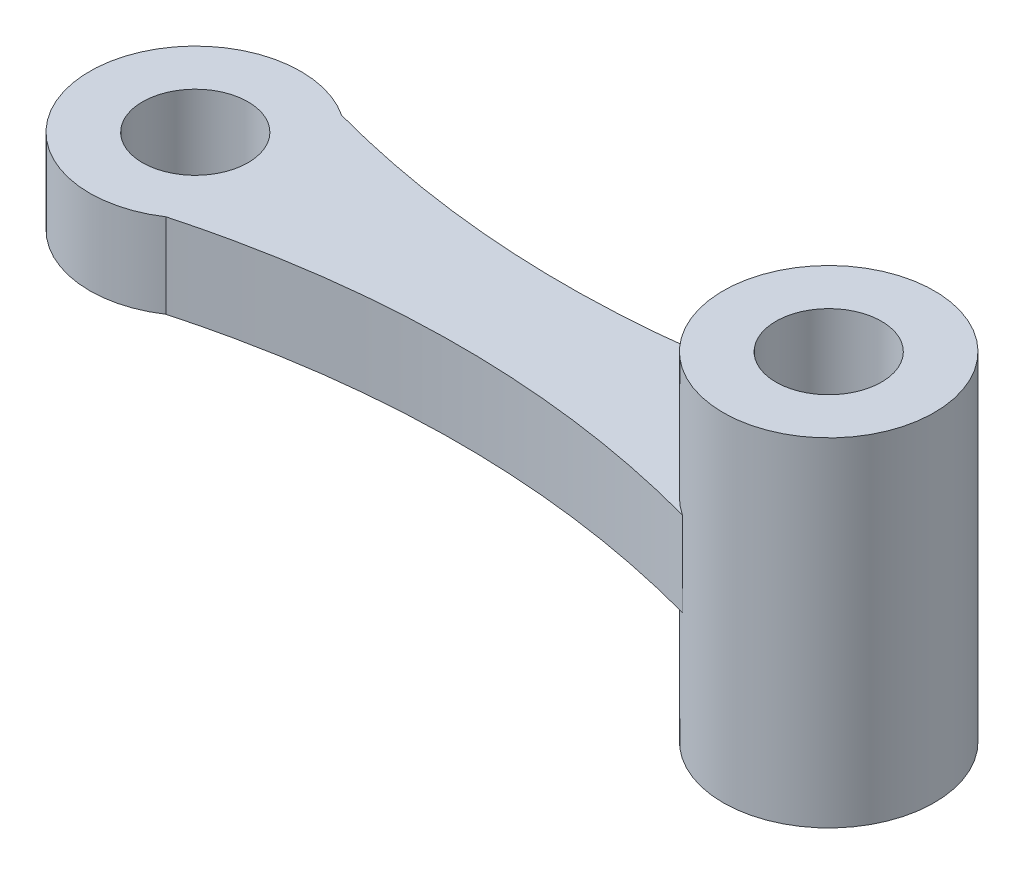
ISO-10303-21;
HEADER;
FILE_DESCRIPTION(('STEP AP214'),'2;1');
FILE_NAME('part.step','',(''),(''),'','','');
FILE_SCHEMA(('AUTOMOTIVE_DESIGN { 1 0 10303 214 1 1 1 1 }'));
ENDSEC;
DATA;
#1=APPLICATION_CONTEXT('core data for automotive mechanical design processes');
#2=APPLICATION_PROTOCOL_DEFINITION('international standard','automotive_design',2000,#1);
#3=PRODUCT_CONTEXT('',#1,'mechanical');
#4=PRODUCT('Part','Part','',(#3));
#5=PRODUCT_RELATED_PRODUCT_CATEGORY('part','',(#4));
#6=PRODUCT_DEFINITION_FORMATION('','',#4);
#7=PRODUCT_DEFINITION_CONTEXT('part definition',#1,'design');
#8=PRODUCT_DEFINITION('design','',#6,#7);
#9=PRODUCT_DEFINITION_SHAPE('','',#8);
#10=(LENGTH_UNIT() NAMED_UNIT(*) SI_UNIT(.MILLI.,.METRE.));
#11=(NAMED_UNIT(*) PLANE_ANGLE_UNIT() SI_UNIT($,.RADIAN.));
#12=(NAMED_UNIT(*) SI_UNIT($,.STERADIAN.) SOLID_ANGLE_UNIT());
#13=UNCERTAINTY_MEASURE_WITH_UNIT(LENGTH_MEASURE(1.E-05),#10,'distance_accuracy_value','');
#14=(GEOMETRIC_REPRESENTATION_CONTEXT(3) GLOBAL_UNCERTAINTY_ASSIGNED_CONTEXT((#13)) GLOBAL_UNIT_ASSIGNED_CONTEXT((#10,
#11,#12)) REPRESENTATION_CONTEXT('',''));
#15=CARTESIAN_POINT('',(0.,0.,0.));
#16=DIRECTION('',(0.,0.,1.));
#17=DIRECTION('',(1.,0.,0.));
#18=AXIS2_PLACEMENT_3D('',#15,#16,#17);
#19=CARTESIAN_POINT('',(0.,4.,0.));
#20=DIRECTION('',(0.,1.,0.));
#21=DIRECTION('',(0.,0.,1.));
#22=AXIS2_PLACEMENT_3D('',#19,#20,#21);
#23=PLANE('',#22);
#24=CARTESIAN_POINT('',(27.2283191686071,4.,4.16146432988306));
#25=CARTESIAN_POINT('',(23.1522127790642,4.,3.0538214432916));
#26=CARTESIAN_POINT('',(14.9999999999854,4.,1.94617855670989));
#27=CARTESIAN_POINT('',(6.84778722095193,4.,3.05382144328863));
#28=CARTESIAN_POINT('',(2.7716808313972,4.,4.16146432988021));
#29=B_SPLINE_CURVE_WITH_KNOTS('',3,(#24,#25,#26,#27,#28),.UNSPECIFIED.,.F.,.F.,(4,1,4),
(0.0923893610453886,0.499999999999672,0.907610638954284),.UNSPECIFIED.);
#30=CARTESIAN_POINT('',(27.2283191686071,4.,4.16146432988306));
#31=VERTEX_POINT('',#30);
#32=CARTESIAN_POINT('',(2.7716808313972,4.,4.16146432988021));
#33=VERTEX_POINT('',#32);
#34=EDGE_CURVE('E76',#31,#33,#29,.T.);
#35=ORIENTED_EDGE('',*,*,#34,.F.);
#36=CARTESIAN_POINT('',(30.,4.,0.));
#37=DIRECTION('',(0.,1.,0.));
#38=DIRECTION('',(0.,0.,1.));
#39=AXIS2_PLACEMENT_3D('',#36,#37,#38);
#40=CIRCLE('',#39,5.);
#41=CARTESIAN_POINT('',(27.2283191686028,4.,-4.16146432988021));
#42=VERTEX_POINT('',#41);
#43=EDGE_CURVE('E165',#42,#31,#40,.T.);
#44=ORIENTED_EDGE('',*,*,#43,.F.);
#45=CARTESIAN_POINT('',(2.7716808313972,4.,-4.16146432988021));
#46=CARTESIAN_POINT('',(6.84778722094081,4.,-3.05382144328833));
#47=CARTESIAN_POINT('',(14.9999999999983,4.,-1.94617855670935));
#48=CARTESIAN_POINT('',(23.1522127790509,4.,-3.05382144329299));
#49=CARTESIAN_POINT('',(27.2283191686028,4.,-4.16146432988021));
#50=B_SPLINE_CURVE_WITH_KNOTS('',3,(#45,#46,#47,#48,#49),.UNSPECIFIED.,.F.,.F.,(4,1,4),
(0.0923893610456388,0.5,0.907610638954066),.UNSPECIFIED.);
#51=CARTESIAN_POINT('',(2.7716808313972,4.,-4.16146432988021));
#52=VERTEX_POINT('',#51);
#53=EDGE_CURVE('E79',#52,#42,#50,.T.);
#54=ORIENTED_EDGE('',*,*,#53,.F.);
#55=CARTESIAN_POINT('',(0.,4.,0.));
#56=DIRECTION('',(0.,1.,0.));
#57=DIRECTION('',(0.,0.,1.));
#58=AXIS2_PLACEMENT_3D('',#55,#56,#57);
#59=CIRCLE('',#58,5.);
#60=EDGE_CURVE('E11',#52,#33,#59,.T.);
#61=ORIENTED_EDGE('',*,*,#60,.T.);
#62=EDGE_LOOP('',(#35,#44,#54,#61));
#63=FACE_BOUND('',#62,.T.);
#64=CARTESIAN_POINT('',(0.,4.,0.));
#65=DIRECTION('',(0.,1.,0.));
#66=DIRECTION('',(0.,0.,1.));
#67=AXIS2_PLACEMENT_3D('',#64,#65,#66);
#68=CIRCLE('',#67,2.5);
#69=CARTESIAN_POINT('',(0.,4.,2.5));
#70=VERTEX_POINT('',#69);
#71=EDGE_CURVE('E168',#70,#70,#68,.T.);
#72=ORIENTED_EDGE('',*,*,#71,.F.);
#73=EDGE_LOOP('',(#72));
#74=FACE_BOUND('',#73,.T.);
#75=ADVANCED_FACE('F33',(#63,#74),#23,.T.);
#76=CARTESIAN_POINT('',(0.,0.,0.));
#77=DIRECTION('',(0.,1.,0.));
#78=DIRECTION('',(0.,0.,1.));
#79=AXIS2_PLACEMENT_3D('',#76,#77,#78);
#80=PLANE('',#79);
#81=CARTESIAN_POINT('',(30.,0.,0.));
#82=DIRECTION('',(0.,1.,0.));
#83=DIRECTION('',(0.,0.,1.));
#84=AXIS2_PLACEMENT_3D('',#81,#82,#83);
#85=CIRCLE('',#84,5.);
#86=CARTESIAN_POINT('',(27.2283191686028,0.,-4.16146432988021));
#87=VERTEX_POINT('',#86);
#88=CARTESIAN_POINT('',(27.2283191686071,0.,4.16146432988306));
#89=VERTEX_POINT('',#88);
#90=EDGE_CURVE('E163',#87,#89,#85,.T.);
#91=ORIENTED_EDGE('',*,*,#90,.T.);
#92=CARTESIAN_POINT('',(27.2283191686071,0.,4.16146432988306));
#93=CARTESIAN_POINT('',(23.1522127790642,0.,3.0538214432916));
#94=CARTESIAN_POINT('',(14.9999999999854,0.,1.94617855670989));
#95=CARTESIAN_POINT('',(6.84778722095193,0.,3.05382144328863));
#96=CARTESIAN_POINT('',(2.7716808313972,0.,4.16146432988021));
#97=B_SPLINE_CURVE_WITH_KNOTS('',3,(#92,#93,#94,#95,#96),.UNSPECIFIED.,.F.,.F.,(4,1,4),
(0.0923893610453886,0.499999999999672,0.907610638954284),.UNSPECIFIED.);
#98=CARTESIAN_POINT('',(2.7716808313972,0.,4.16146432988021));
#99=VERTEX_POINT('',#98);
#100=EDGE_CURVE('E54',#89,#99,#97,.T.);
#101=ORIENTED_EDGE('',*,*,#100,.T.);
#102=CARTESIAN_POINT('',(0.,0.,0.));
#103=DIRECTION('',(0.,1.,0.));
#104=DIRECTION('',(0.,0.,1.));
#105=AXIS2_PLACEMENT_3D('',#102,#103,#104);
#106=CIRCLE('',#105,5.);
#107=CARTESIAN_POINT('',(2.7716808313972,0.,-4.16146432988021));
#108=VERTEX_POINT('',#107);
#109=EDGE_CURVE('E37',#108,#99,#106,.T.);
#110=ORIENTED_EDGE('',*,*,#109,.F.);
#111=CARTESIAN_POINT('',(2.7716808313972,0.,-4.16146432988021));
#112=CARTESIAN_POINT('',(6.84778722094081,0.,-3.05382144328833));
#113=CARTESIAN_POINT('',(14.9999999999983,0.,-1.94617855670935));
#114=CARTESIAN_POINT('',(23.1522127790509,0.,-3.05382144329299));
#115=CARTESIAN_POINT('',(27.2283191686028,0.,-4.16146432988021));
#116=B_SPLINE_CURVE_WITH_KNOTS('',3,(#111,#112,#113,#114,#115),.UNSPECIFIED.,.F.,.F.,(4,1,4),
(0.0923893610456388,0.5,0.907610638954066),.UNSPECIFIED.);
#117=EDGE_CURVE('E99',#108,#87,#116,.T.);
#118=ORIENTED_EDGE('',*,*,#117,.T.);
#119=EDGE_LOOP('',(#91,#101,#110,#118));
#120=FACE_BOUND('',#119,.T.);
#121=CARTESIAN_POINT('',(0.,0.,0.));
#122=DIRECTION('',(0.,1.,0.));
#123=DIRECTION('',(0.,0.,1.));
#124=AXIS2_PLACEMENT_3D('',#121,#122,#123);
#125=CIRCLE('',#124,2.5);
#126=CARTESIAN_POINT('',(0.,0.,2.5));
#127=VERTEX_POINT('',#126);
#128=EDGE_CURVE('E167',#127,#127,#125,.T.);
#129=ORIENTED_EDGE('',*,*,#128,.T.);
#130=EDGE_LOOP('',(#129));
#131=FACE_BOUND('',#130,.T.);
#132=ADVANCED_FACE('F135',(#120,#131),#80,.F.);
#133=CARTESIAN_POINT('',(0.,4.,0.));
#134=DIRECTION('',(0.,-1.,0.));
#135=DIRECTION('',(0.,0.,-1.));
#136=AXIS2_PLACEMENT_3D('',#133,#134,#135);
#137=CYLINDRICAL_SURFACE('',#136,5.);
#138=ORIENTED_EDGE('',*,*,#109,.T.);
#139=DIRECTION('',(0.,1.,0.));
#140=VECTOR('',#139,1.);
#141=CARTESIAN_POINT('',(2.7716808313972,-6.,4.16146432988021));
#142=LINE('',#141,#140);
#143=EDGE_CURVE('E81',#99,#33,#142,.T.);
#144=ORIENTED_EDGE('',*,*,#143,.T.);
#145=ORIENTED_EDGE('',*,*,#60,.F.);
#146=DIRECTION('',(0.,1.,0.));
#147=VECTOR('',#146,1.);
#148=CARTESIAN_POINT('',(2.7716808313972,-6.,-4.16146432988021));
#149=LINE('',#148,#147);
#150=EDGE_CURVE('E85',#108,#52,#149,.T.);
#151=ORIENTED_EDGE('',*,*,#150,.F.);
#152=EDGE_LOOP('',(#138,#144,#145,#151));
#153=FACE_BOUND('',#152,.T.);
#154=ADVANCED_FACE('F35',(#153),#137,.T.);
#155=CARTESIAN_POINT('',(30.,4.,0.));
#156=DIRECTION('',(0.,-1.,0.));
#157=DIRECTION('',(0.,0.,-1.));
#158=AXIS2_PLACEMENT_3D('',#155,#156,#157);
#159=CYLINDRICAL_SURFACE('',#158,5.);
#160=DIRECTION('',(0.,1.,0.));
#161=VECTOR('',#160,1.);
#162=CARTESIAN_POINT('',(27.2283191686071,-6.,4.16146432988306));
#163=LINE('',#162,#161);
#164=EDGE_CURVE('E82',#89,#31,#163,.T.);
#165=ORIENTED_EDGE('',*,*,#164,.F.);
#166=ORIENTED_EDGE('',*,*,#90,.F.);
#167=DIRECTION('',(0.,1.,0.));
#168=VECTOR('',#167,1.);
#169=CARTESIAN_POINT('',(27.2283191686028,-6.,-4.16146432988021));
#170=LINE('',#169,#168);
#171=EDGE_CURVE('E87',#87,#42,#170,.T.);
#172=ORIENTED_EDGE('',*,*,#171,.T.);
#173=ORIENTED_EDGE('',*,*,#43,.T.);
#174=EDGE_LOOP('',(#165,#166,#172,#173));
#175=FACE_BOUND('',#174,.T.);
#176=CARTESIAN_POINT('',(30.,-6.,0.));
#177=DIRECTION('',(0.,1.,0.));
#178=DIRECTION('',(0.,0.,1.));
#179=AXIS2_PLACEMENT_3D('',#176,#177,#178);
#180=CIRCLE('',#179,5.);
#181=CARTESIAN_POINT('',(30.,-6.,5.));
#182=VERTEX_POINT('',#181);
#183=EDGE_CURVE('E149',#182,#182,#180,.T.);
#184=ORIENTED_EDGE('',*,*,#183,.T.);
#185=EDGE_LOOP('',(#184));
#186=FACE_BOUND('',#185,.T.);
#187=CARTESIAN_POINT('',(30.,10.,0.));
#188=DIRECTION('',(0.,1.,0.));
#189=DIRECTION('',(0.,0.,1.));
#190=AXIS2_PLACEMENT_3D('',#187,#188,#189);
#191=CIRCLE('',#190,5.);
#192=CARTESIAN_POINT('',(30.,10.,5.));
#193=VERTEX_POINT('',#192);
#194=EDGE_CURVE('E152',#193,#193,#191,.T.);
#195=ORIENTED_EDGE('',*,*,#194,.F.);
#196=EDGE_LOOP('',(#195));
#197=FACE_BOUND('',#196,.T.);
#198=ADVANCED_FACE('F131',(#175,#186,#197),#159,.T.);
#199=CARTESIAN_POINT('',(0.,4.,0.));
#200=DIRECTION('',(0.,-1.,0.));
#201=DIRECTION('',(0.,0.,-1.));
#202=AXIS2_PLACEMENT_3D('',#199,#200,#201);
#203=CYLINDRICAL_SURFACE('',#202,2.5);
#204=ORIENTED_EDGE('',*,*,#71,.T.);
#205=EDGE_LOOP('',(#204));
#206=FACE_BOUND('',#205,.T.);
#207=ORIENTED_EDGE('',*,*,#128,.F.);
#208=EDGE_LOOP('',(#207));
#209=FACE_BOUND('',#208,.T.);
#210=ADVANCED_FACE('F124',(#206,#209),#203,.F.);
#211=CARTESIAN_POINT('',(30.,-6.,0.));
#212=DIRECTION('',(0.,1.,0.));
#213=DIRECTION('',(0.,0.,1.));
#214=AXIS2_PLACEMENT_3D('',#211,#212,#213);
#215=PLANE('',#214);
#216=CARTESIAN_POINT('',(30.,-6.,0.));
#217=DIRECTION('',(0.,1.,0.));
#218=DIRECTION('',(0.,0.,1.));
#219=AXIS2_PLACEMENT_3D('',#216,#217,#218);
#220=CIRCLE('',#219,2.5);
#221=CARTESIAN_POINT('',(30.,-6.,2.5));
#222=VERTEX_POINT('',#221);
#223=EDGE_CURVE('E153',#222,#222,#220,.T.);
#224=ORIENTED_EDGE('',*,*,#223,.T.);
#225=EDGE_LOOP('',(#224));
#226=FACE_BOUND('',#225,.T.);
#227=ORIENTED_EDGE('',*,*,#183,.F.);
#228=EDGE_LOOP('',(#227));
#229=FACE_BOUND('',#228,.T.);
#230=ADVANCED_FACE('F121',(#226,#229),#215,.F.);
#231=CARTESIAN_POINT('',(30.,4.,0.));
#232=DIRECTION('',(0.,-1.,0.));
#233=DIRECTION('',(0.,0.,-1.));
#234=AXIS2_PLACEMENT_3D('',#231,#232,#233);
#235=CYLINDRICAL_SURFACE('',#234,2.5);
#236=ORIENTED_EDGE('',*,*,#223,.F.);
#237=EDGE_LOOP('',(#236));
#238=FACE_BOUND('',#237,.T.);
#239=CARTESIAN_POINT('',(30.,10.,0.));
#240=DIRECTION('',(0.,1.,0.));
#241=DIRECTION('',(0.,0.,1.));
#242=AXIS2_PLACEMENT_3D('',#239,#240,#241);
#243=CIRCLE('',#242,2.5);
#244=CARTESIAN_POINT('',(30.,10.,2.5));
#245=VERTEX_POINT('',#244);
#246=EDGE_CURVE('E154',#245,#245,#243,.T.);
#247=ORIENTED_EDGE('',*,*,#246,.T.);
#248=EDGE_LOOP('',(#247));
#249=FACE_BOUND('',#248,.T.);
#250=ADVANCED_FACE('F119',(#238,#249),#235,.F.);
#251=CARTESIAN_POINT('',(30.,10.,0.));
#252=DIRECTION('',(0.,1.,0.));
#253=DIRECTION('',(0.,0.,1.));
#254=AXIS2_PLACEMENT_3D('',#251,#252,#253);
#255=PLANE('',#254);
#256=ORIENTED_EDGE('',*,*,#194,.T.);
#257=EDGE_LOOP('',(#256));
#258=FACE_BOUND('',#257,.T.);
#259=ORIENTED_EDGE('',*,*,#246,.F.);
#260=EDGE_LOOP('',(#259));
#261=FACE_BOUND('',#260,.T.);
#262=ADVANCED_FACE('F115',(#258,#261),#255,.T.);
#263=CARTESIAN_POINT('',(2.7716808313972,-6.,-4.16146432988021));
#264=CARTESIAN_POINT('',(6.84778722094081,-6.,-3.05382144328833));
#265=CARTESIAN_POINT('',(14.9999999999983,-6.,-1.94617855670935));
#266=CARTESIAN_POINT('',(23.1522127790509,-6.,-3.05382144329299));
#267=CARTESIAN_POINT('',(27.2283191686028,-6.,-4.16146432988021));
#268=B_SPLINE_CURVE_WITH_KNOTS('',3,(#263,#264,#265,#266,#267),.UNSPECIFIED.,.F.,.F.,(4,1,4),
(0.0923893610456388,0.5,0.907610638954066),.UNSPECIFIED.);
#269=DIRECTION('',(0.,1.,0.));
#270=VECTOR('',#269,1.);
#271=SURFACE_OF_LINEAR_EXTRUSION('',#268,#270);
#272=ORIENTED_EDGE('',*,*,#150,.T.);
#273=ORIENTED_EDGE('',*,*,#53,.T.);
#274=ORIENTED_EDGE('',*,*,#171,.F.);
#275=ORIENTED_EDGE('',*,*,#117,.F.);
#276=EDGE_LOOP('',(#272,#273,#274,#275));
#277=FACE_BOUND('',#276,.T.);
#278=ADVANCED_FACE('F111',(#277),#271,.F.);
#279=CARTESIAN_POINT('',(27.2283191686071,-6.,4.16146432988306));
#280=CARTESIAN_POINT('',(23.1522127790642,-6.,3.0538214432916));
#281=CARTESIAN_POINT('',(14.9999999999854,-6.,1.94617855670989));
#282=CARTESIAN_POINT('',(6.84778722095193,-6.,3.05382144328863));
#283=CARTESIAN_POINT('',(2.7716808313972,-6.,4.16146432988021));
#284=B_SPLINE_CURVE_WITH_KNOTS('',3,(#279,#280,#281,#282,#283),.UNSPECIFIED.,.F.,.F.,(4,1,4),
(0.0923893610453886,0.499999999999672,0.907610638954284),.UNSPECIFIED.);
#285=DIRECTION('',(0.,1.,0.));
#286=VECTOR('',#285,1.);
#287=SURFACE_OF_LINEAR_EXTRUSION('',#284,#286);
#288=ORIENTED_EDGE('',*,*,#164,.T.);
#289=ORIENTED_EDGE('',*,*,#34,.T.);
#290=ORIENTED_EDGE('',*,*,#143,.F.);
#291=ORIENTED_EDGE('',*,*,#100,.F.);
#292=EDGE_LOOP('',(#288,#289,#290,#291));
#293=FACE_BOUND('',#292,.T.);
#294=ADVANCED_FACE('F84',(#293),#287,.F.);
#295=CLOSED_SHELL('',(#75,#132,#154,#198,#210,#230,#250,#262,#278,#294));
#296=MANIFOLD_SOLID_BREP('B2',#295);
#297=ADVANCED_BREP_SHAPE_REPRESENTATION('',(#18,#296),#14);
#298=SHAPE_DEFINITION_REPRESENTATION(#9,#297);
ENDSEC;
END-ISO-10303-21;
